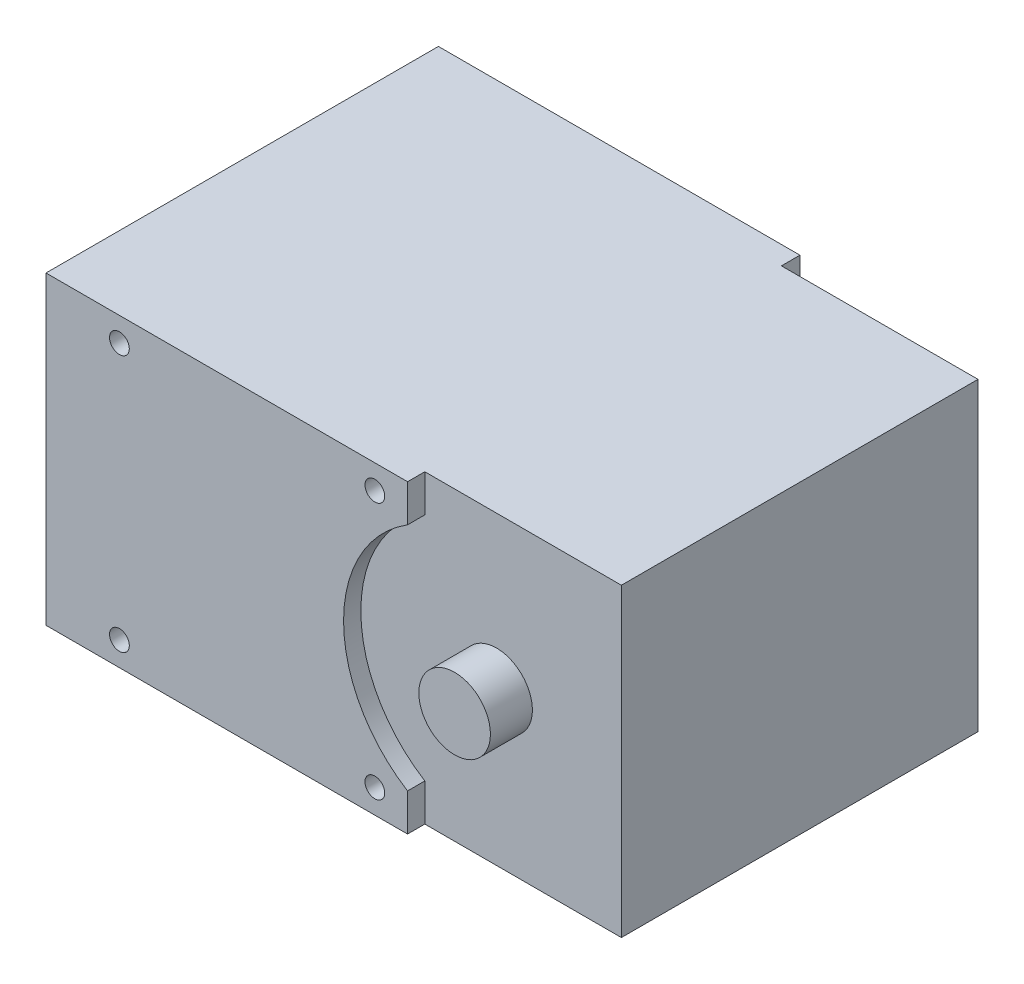
ISO-10303-21;
HEADER;
FILE_DESCRIPTION(('STEP AP214'),'2;1');
FILE_NAME('part.step','',(''),(''),'','','');
FILE_SCHEMA(('AUTOMOTIVE_DESIGN { 1 0 10303 214 1 1 1 1 }'));
ENDSEC;
DATA;
#1=APPLICATION_CONTEXT('core data for automotive mechanical design processes');
#2=APPLICATION_PROTOCOL_DEFINITION('international standard','automotive_design',2000,#1);
#3=PRODUCT_CONTEXT('',#1,'mechanical');
#4=PRODUCT('Part','Part','',(#3));
#5=PRODUCT_RELATED_PRODUCT_CATEGORY('part','',(#4));
#6=PRODUCT_DEFINITION_FORMATION('','',#4);
#7=PRODUCT_DEFINITION_CONTEXT('part definition',#1,'design');
#8=PRODUCT_DEFINITION('design','',#6,#7);
#9=PRODUCT_DEFINITION_SHAPE('','',#8);
#10=(LENGTH_UNIT() NAMED_UNIT(*) SI_UNIT(.MILLI.,.METRE.));
#11=(NAMED_UNIT(*) PLANE_ANGLE_UNIT() SI_UNIT($,.RADIAN.));
#12=(NAMED_UNIT(*) SI_UNIT($,.STERADIAN.) SOLID_ANGLE_UNIT());
#13=UNCERTAINTY_MEASURE_WITH_UNIT(LENGTH_MEASURE(1.E-05),#10,'distance_accuracy_value','');
#14=(GEOMETRIC_REPRESENTATION_CONTEXT(3) GLOBAL_UNCERTAINTY_ASSIGNED_CONTEXT((#13)) GLOBAL_UNIT_ASSIGNED_CONTEXT((#10,
#11,#12)) REPRESENTATION_CONTEXT('',''));
#15=CARTESIAN_POINT('',(0.,0.,0.));
#16=DIRECTION('',(0.,0.,1.));
#17=DIRECTION('',(1.,0.,0.));
#18=AXIS2_PLACEMENT_3D('',#15,#16,#17);
#19=CARTESIAN_POINT('',(0.,0.,28.9));
#20=DIRECTION('',(0.,1.,0.));
#21=DIRECTION('',(0.,0.,1.));
#22=AXIS2_PLACEMENT_3D('',#19,#20,#21);
#23=PLANE('',#22);
#24=DIRECTION('',(0.,0.,-1.));
#25=VECTOR('',#24,1.);
#26=CARTESIAN_POINT('',(0.,0.,28.9));
#27=LINE('',#26,#25);
#28=CARTESIAN_POINT('',(0.,0.,30.3));
#29=VERTEX_POINT('',#28);
#30=CARTESIAN_POINT('',(0.,0.,-1.5));
#31=VERTEX_POINT('',#30);
#32=EDGE_CURVE('E343',#29,#31,#27,.T.);
#33=ORIENTED_EDGE('',*,*,#32,.T.);
#34=DIRECTION('',(-1.,0.,0.));
#35=VECTOR('',#34,1.);
#36=CARTESIAN_POINT('',(0.,0.,-1.5));
#37=LINE('',#36,#35);
#38=CARTESIAN_POINT('',(29.3,0.,-1.5));
#39=VERTEX_POINT('',#38);
#40=EDGE_CURVE('E211',#39,#31,#37,.T.);
#41=ORIENTED_EDGE('',*,*,#40,.F.);
#42=DIRECTION('',(0.,0.,1.));
#43=VECTOR('',#42,1.);
#44=CARTESIAN_POINT('',(29.3,0.,-1.5));
#45=LINE('',#44,#43);
#46=CARTESIAN_POINT('',(29.3,0.,0.));
#47=VERTEX_POINT('',#46);
#48=EDGE_CURVE('E241',#39,#47,#45,.T.);
#49=ORIENTED_EDGE('',*,*,#48,.T.);
#50=DIRECTION('',(1.,0.,0.));
#51=VECTOR('',#50,1.);
#52=CARTESIAN_POINT('',(0.,0.,0.));
#53=LINE('',#52,#51);
#54=CARTESIAN_POINT('',(45.23,0.,0.));
#55=VERTEX_POINT('',#54);
#56=EDGE_CURVE('E320',#47,#55,#53,.T.);
#57=ORIENTED_EDGE('',*,*,#56,.T.);
#58=DIRECTION('',(0.,0.,-1.));
#59=VECTOR('',#58,1.);
#60=CARTESIAN_POINT('',(45.23,0.,28.9));
#61=LINE('',#60,#59);
#62=CARTESIAN_POINT('',(45.23,0.,28.9));
#63=VERTEX_POINT('',#62);
#64=EDGE_CURVE('E340',#63,#55,#61,.T.);
#65=ORIENTED_EDGE('',*,*,#64,.F.);
#66=DIRECTION('',(1.,0.,0.));
#67=VECTOR('',#66,1.);
#68=CARTESIAN_POINT('',(0.,0.,28.9));
#69=LINE('',#68,#67);
#70=CARTESIAN_POINT('',(29.3,0.,28.9));
#71=VERTEX_POINT('',#70);
#72=EDGE_CURVE('E321',#71,#63,#69,.T.);
#73=ORIENTED_EDGE('',*,*,#72,.F.);
#74=DIRECTION('',(0.,0.,-1.));
#75=VECTOR('',#74,1.);
#76=CARTESIAN_POINT('',(29.3,0.,30.3));
#77=LINE('',#76,#75);
#78=CARTESIAN_POINT('',(29.3,0.,30.3));
#79=VERTEX_POINT('',#78);
#80=EDGE_CURVE('E311',#79,#71,#77,.T.);
#81=ORIENTED_EDGE('',*,*,#80,.F.);
#82=DIRECTION('',(1.,0.,0.));
#83=VECTOR('',#82,1.);
#84=CARTESIAN_POINT('',(0.,0.,30.3));
#85=LINE('',#84,#83);
#86=EDGE_CURVE('E297',#29,#79,#85,.T.);
#87=ORIENTED_EDGE('',*,*,#86,.F.);
#88=EDGE_LOOP('',(#33,#41,#49,#57,#65,#73,#81,#87));
#89=FACE_BOUND('',#88,.T.);
#90=ADVANCED_FACE('F63',(#89),#23,.F.);
#91=CARTESIAN_POINT('',(0.,24.73,28.9));
#92=DIRECTION('',(0.,-1.,0.));
#93=DIRECTION('',(0.,0.,-1.));
#94=AXIS2_PLACEMENT_3D('',#91,#92,#93);
#95=PLANE('',#94);
#96=DIRECTION('',(0.,0.,1.));
#97=VECTOR('',#96,1.);
#98=CARTESIAN_POINT('',(29.3,24.73,-1.5));
#99=LINE('',#98,#97);
#100=CARTESIAN_POINT('',(29.3,24.73,-1.5));
#101=VERTEX_POINT('',#100);
#102=CARTESIAN_POINT('',(29.3,24.73,0.));
#103=VERTEX_POINT('',#102);
#104=EDGE_CURVE('E238',#101,#103,#99,.T.);
#105=ORIENTED_EDGE('',*,*,#104,.F.);
#106=DIRECTION('',(1.,0.,0.));
#107=VECTOR('',#106,1.);
#108=CARTESIAN_POINT('',(0.,24.73,-1.5));
#109=LINE('',#108,#107);
#110=CARTESIAN_POINT('',(0.,24.73,-1.5));
#111=VERTEX_POINT('',#110);
#112=EDGE_CURVE('E215',#111,#101,#109,.T.);
#113=ORIENTED_EDGE('',*,*,#112,.F.);
#114=DIRECTION('',(0.,0.,-1.));
#115=VECTOR('',#114,1.);
#116=CARTESIAN_POINT('',(0.,24.73,28.9));
#117=LINE('',#116,#115);
#118=CARTESIAN_POINT('',(0.,24.73,30.3));
#119=VERTEX_POINT('',#118);
#120=EDGE_CURVE('E329',#119,#111,#117,.T.);
#121=ORIENTED_EDGE('',*,*,#120,.F.);
#122=DIRECTION('',(-1.,0.,0.));
#123=VECTOR('',#122,1.);
#124=CARTESIAN_POINT('',(0.,24.73,30.3));
#125=LINE('',#124,#123);
#126=CARTESIAN_POINT('',(29.3,24.73,30.3));
#127=VERTEX_POINT('',#126);
#128=EDGE_CURVE('E291',#127,#119,#125,.T.);
#129=ORIENTED_EDGE('',*,*,#128,.F.);
#130=DIRECTION('',(0.,0.,-1.));
#131=VECTOR('',#130,1.);
#132=CARTESIAN_POINT('',(29.3,24.73,30.3));
#133=LINE('',#132,#131);
#134=CARTESIAN_POINT('',(29.3,24.73,28.9));
#135=VERTEX_POINT('',#134);
#136=EDGE_CURVE('E313',#127,#135,#133,.T.);
#137=ORIENTED_EDGE('',*,*,#136,.T.);
#138=DIRECTION('',(-1.,0.,0.));
#139=VECTOR('',#138,1.);
#140=CARTESIAN_POINT('',(0.,24.73,28.9));
#141=LINE('',#140,#139);
#142=CARTESIAN_POINT('',(45.23,24.73,28.9));
#143=VERTEX_POINT('',#142);
#144=EDGE_CURVE('E326',#143,#135,#141,.T.);
#145=ORIENTED_EDGE('',*,*,#144,.F.);
#146=DIRECTION('',(0.,0.,-1.));
#147=VECTOR('',#146,1.);
#148=CARTESIAN_POINT('',(45.23,24.73,28.9));
#149=LINE('',#148,#147);
#150=CARTESIAN_POINT('',(45.23,24.73,0.));
#151=VERTEX_POINT('',#150);
#152=EDGE_CURVE('E337',#143,#151,#149,.T.);
#153=ORIENTED_EDGE('',*,*,#152,.T.);
#154=DIRECTION('',(-1.,0.,0.));
#155=VECTOR('',#154,1.);
#156=CARTESIAN_POINT('',(0.,24.73,0.));
#157=LINE('',#156,#155);
#158=EDGE_CURVE('E324',#151,#103,#157,.T.);
#159=ORIENTED_EDGE('',*,*,#158,.T.);
#160=EDGE_LOOP('',(#105,#113,#121,#129,#137,#145,#153,#159));
#161=FACE_BOUND('',#160,.T.);
#162=ADVANCED_FACE('F382',(#161),#95,.F.);
#163=CARTESIAN_POINT('',(0.,0.,28.9));
#164=DIRECTION('',(1.,0.,0.));
#165=DIRECTION('',(0.,0.,-1.));
#166=AXIS2_PLACEMENT_3D('',#163,#164,#165);
#167=PLANE('',#166);
#168=ORIENTED_EDGE('',*,*,#120,.T.);
#169=DIRECTION('',(0.,1.,0.));
#170=VECTOR('',#169,1.);
#171=CARTESIAN_POINT('',(0.,0.,-1.5));
#172=LINE('',#171,#170);
#173=EDGE_CURVE('E213',#31,#111,#172,.T.);
#174=ORIENTED_EDGE('',*,*,#173,.F.);
#175=ORIENTED_EDGE('',*,*,#32,.F.);
#176=DIRECTION('',(0.,-1.,0.));
#177=VECTOR('',#176,1.);
#178=CARTESIAN_POINT('',(0.,0.,30.3));
#179=LINE('',#178,#177);
#180=EDGE_CURVE('E294',#119,#29,#179,.T.);
#181=ORIENTED_EDGE('',*,*,#180,.F.);
#182=EDGE_LOOP('',(#168,#174,#175,#181));
#183=FACE_BOUND('',#182,.T.);
#184=ADVANCED_FACE('F65',(#183),#167,.F.);
#185=CARTESIAN_POINT('',(45.23,0.,28.9));
#186=DIRECTION('',(-1.,0.,0.));
#187=DIRECTION('',(0.,0.,1.));
#188=AXIS2_PLACEMENT_3D('',#185,#186,#187);
#189=PLANE('',#188);
#190=DIRECTION('',(0.,1.,0.));
#191=VECTOR('',#190,1.);
#192=CARTESIAN_POINT('',(45.23,0.,0.));
#193=LINE('',#192,#191);
#194=EDGE_CURVE('E331',#55,#151,#193,.T.);
#195=ORIENTED_EDGE('',*,*,#194,.T.);
#196=ORIENTED_EDGE('',*,*,#152,.F.);
#197=DIRECTION('',(0.,1.,0.));
#198=VECTOR('',#197,1.);
#199=CARTESIAN_POINT('',(45.23,0.,28.9));
#200=LINE('',#199,#198);
#201=EDGE_CURVE('E323',#63,#143,#200,.T.);
#202=ORIENTED_EDGE('',*,*,#201,.F.);
#203=ORIENTED_EDGE('',*,*,#64,.T.);
#204=EDGE_LOOP('',(#195,#196,#202,#203));
#205=FACE_BOUND('',#204,.T.);
#206=ADVANCED_FACE('F390',(#205),#189,.F.);
#207=CARTESIAN_POINT('',(0.,0.,28.9));
#208=DIRECTION('',(0.,0.,-1.));
#209=DIRECTION('',(-1.,0.,0.));
#210=AXIS2_PLACEMENT_3D('',#207,#208,#209);
#211=PLANE('',#210);
#212=CARTESIAN_POINT('',(35.115,12.365,28.9));
#213=DIRECTION('',(0.,0.,-1.));
#214=DIRECTION('',(-1.,0.,0.));
#215=AXIS2_PLACEMENT_3D('',#212,#213,#214);
#216=CIRCLE('',#215,2.9);
#217=CARTESIAN_POINT('',(32.215,12.365,28.9));
#218=VERTEX_POINT('',#217);
#219=EDGE_CURVE('E346',#218,#218,#216,.F.);
#220=ORIENTED_EDGE('',*,*,#219,.F.);
#221=EDGE_LOOP('',(#220));
#222=FACE_BOUND('',#221,.T.);
#223=ORIENTED_EDGE('',*,*,#144,.T.);
#224=DIRECTION('',(0.,-1.,0.));
#225=VECTOR('',#224,1.);
#226=CARTESIAN_POINT('',(29.3,0.,28.9));
#227=LINE('',#226,#225);
#228=CARTESIAN_POINT('',(29.3,21.7023323278118,28.9));
#229=VERTEX_POINT('',#228);
#230=EDGE_CURVE('E305',#135,#229,#227,.T.);
#231=ORIENTED_EDGE('',*,*,#230,.T.);
#232=CARTESIAN_POINT('',(35.115,12.365,28.9));
#233=DIRECTION('',(0.,0.,1.));
#234=DIRECTION('',(1.,0.,0.));
#235=AXIS2_PLACEMENT_3D('',#232,#233,#234);
#236=CIRCLE('',#235,11.);
#237=CARTESIAN_POINT('',(29.3,3.02766767218816,28.9));
#238=VERTEX_POINT('',#237);
#239=EDGE_CURVE('E281',#229,#238,#236,.T.);
#240=ORIENTED_EDGE('',*,*,#239,.T.);
#241=DIRECTION('',(0.,-1.,0.));
#242=VECTOR('',#241,1.);
#243=CARTESIAN_POINT('',(29.3,0.,28.9));
#244=LINE('',#243,#242);
#245=EDGE_CURVE('E288',#238,#71,#244,.T.);
#246=ORIENTED_EDGE('',*,*,#245,.T.);
#247=ORIENTED_EDGE('',*,*,#72,.T.);
#248=ORIENTED_EDGE('',*,*,#201,.T.);
#249=EDGE_LOOP('',(#223,#231,#240,#246,#247,#248));
#250=FACE_BOUND('',#249,.T.);
#251=ADVANCED_FACE('F392',(#222,#250),#211,.F.);
#252=CARTESIAN_POINT('',(0.,0.,0.));
#253=DIRECTION('',(0.,0.,-1.));
#254=DIRECTION('',(-1.,0.,0.));
#255=AXIS2_PLACEMENT_3D('',#252,#253,#254);
#256=PLANE('',#255);
#257=CARTESIAN_POINT('',(35.115,12.365,0.));
#258=DIRECTION('',(0.,0.,-1.));
#259=DIRECTION('',(-1.,0.,0.));
#260=AXIS2_PLACEMENT_3D('',#257,#258,#259);
#261=CIRCLE('',#260,2.9);
#262=CARTESIAN_POINT('',(32.215,12.365,0.));
#263=VERTEX_POINT('',#262);
#264=EDGE_CURVE('E359',#263,#263,#261,.T.);
#265=ORIENTED_EDGE('',*,*,#264,.F.);
#266=EDGE_LOOP('',(#265));
#267=FACE_BOUND('',#266,.T.);
#268=DIRECTION('',(0.,-1.,0.));
#269=VECTOR('',#268,1.);
#270=CARTESIAN_POINT('',(29.3,0.,0.));
#271=LINE('',#270,#269);
#272=CARTESIAN_POINT('',(29.3,21.7023323278118,0.));
#273=VERTEX_POINT('',#272);
#274=EDGE_CURVE('E209',#103,#273,#271,.T.);
#275=ORIENTED_EDGE('',*,*,#274,.F.);
#276=ORIENTED_EDGE('',*,*,#158,.F.);
#277=ORIENTED_EDGE('',*,*,#194,.F.);
#278=ORIENTED_EDGE('',*,*,#56,.F.);
#279=DIRECTION('',(0.,-1.,0.));
#280=VECTOR('',#279,1.);
#281=CARTESIAN_POINT('',(29.3,0.,0.));
#282=LINE('',#281,#280);
#283=CARTESIAN_POINT('',(29.3,3.02766767218816,0.));
#284=VERTEX_POINT('',#283);
#285=EDGE_CURVE('E199',#284,#47,#282,.T.);
#286=ORIENTED_EDGE('',*,*,#285,.F.);
#287=CARTESIAN_POINT('',(35.115,12.365,0.));
#288=DIRECTION('',(0.,0.,-1.));
#289=DIRECTION('',(-1.,0.,0.));
#290=AXIS2_PLACEMENT_3D('',#287,#288,#289);
#291=CIRCLE('',#290,11.);
#292=EDGE_CURVE('E196',#284,#273,#291,.T.);
#293=ORIENTED_EDGE('',*,*,#292,.T.);
#294=EDGE_LOOP('',(#275,#276,#277,#278,#286,#293));
#295=FACE_BOUND('',#294,.T.);
#296=ADVANCED_FACE('F395',(#267,#295),#256,.T.);
#297=CARTESIAN_POINT('',(35.115,12.365,32.3));
#298=DIRECTION('',(0.,0.,-1.));
#299=DIRECTION('',(-1.,0.,0.));
#300=AXIS2_PLACEMENT_3D('',#297,#298,#299);
#301=CYLINDRICAL_SURFACE('',#300,2.9);
#302=CARTESIAN_POINT('',(35.115,12.365,32.3));
#303=DIRECTION('',(0.,0.,1.));
#304=DIRECTION('',(1.,0.,0.));
#305=AXIS2_PLACEMENT_3D('',#302,#303,#304);
#306=CIRCLE('',#305,2.9);
#307=CARTESIAN_POINT('',(38.015,12.365,32.3));
#308=VERTEX_POINT('',#307);
#309=EDGE_CURVE('E317',#308,#308,#306,.T.);
#310=ORIENTED_EDGE('',*,*,#309,.F.);
#311=EDGE_LOOP('',(#310));
#312=FACE_BOUND('',#311,.T.);
#313=ORIENTED_EDGE('',*,*,#219,.T.);
#314=EDGE_LOOP('',(#313));
#315=FACE_BOUND('',#314,.T.);
#316=ADVANCED_FACE('F398',(#312,#315),#301,.T.);
#317=CARTESIAN_POINT('',(35.115,12.365,32.3));
#318=DIRECTION('',(0.,0.,1.));
#319=DIRECTION('',(1.,0.,0.));
#320=AXIS2_PLACEMENT_3D('',#317,#318,#319);
#321=PLANE('',#320);
#322=ORIENTED_EDGE('',*,*,#309,.T.);
#323=EDGE_LOOP('',(#322));
#324=FACE_BOUND('',#323,.T.);
#325=ADVANCED_FACE('F405',(#324),#321,.T.);
#326=CARTESIAN_POINT('',(35.115,12.365,30.3));
#327=DIRECTION('',(0.,0.,-1.));
#328=DIRECTION('',(-1.,0.,0.));
#329=AXIS2_PLACEMENT_3D('',#326,#327,#328);
#330=CYLINDRICAL_SURFACE('',#329,11.);
#331=ORIENTED_EDGE('',*,*,#239,.F.);
#332=DIRECTION('',(0.,0.,-1.));
#333=VECTOR('',#332,1.);
#334=CARTESIAN_POINT('',(29.3,21.7023323278118,30.3));
#335=LINE('',#334,#333);
#336=CARTESIAN_POINT('',(29.3,21.7023323278118,30.3));
#337=VERTEX_POINT('',#336);
#338=EDGE_CURVE('E315',#337,#229,#335,.T.);
#339=ORIENTED_EDGE('',*,*,#338,.F.);
#340=CARTESIAN_POINT('',(35.115,12.365,30.3));
#341=DIRECTION('',(0.,0.,1.));
#342=DIRECTION('',(1.,0.,0.));
#343=AXIS2_PLACEMENT_3D('',#340,#341,#342);
#344=CIRCLE('',#343,11.);
#345=CARTESIAN_POINT('',(29.3,3.02766767218816,30.3));
#346=VERTEX_POINT('',#345);
#347=EDGE_CURVE('E284',#337,#346,#344,.T.);
#348=ORIENTED_EDGE('',*,*,#347,.T.);
#349=DIRECTION('',(0.,0.,-1.));
#350=VECTOR('',#349,1.);
#351=CARTESIAN_POINT('',(29.3,3.02766767218816,30.3));
#352=LINE('',#351,#350);
#353=EDGE_CURVE('E302',#346,#238,#352,.T.);
#354=ORIENTED_EDGE('',*,*,#353,.T.);
#355=EDGE_LOOP('',(#331,#339,#348,#354));
#356=FACE_BOUND('',#355,.T.);
#357=ADVANCED_FACE('F409',(#356),#330,.F.);
#358=CARTESIAN_POINT('',(29.3,0.,30.3));
#359=DIRECTION('',(1.,0.,0.));
#360=DIRECTION('',(0.,0.,-1.));
#361=AXIS2_PLACEMENT_3D('',#358,#359,#360);
#362=PLANE('',#361);
#363=ORIENTED_EDGE('',*,*,#230,.F.);
#364=ORIENTED_EDGE('',*,*,#136,.F.);
#365=DIRECTION('',(0.,-1.,0.));
#366=VECTOR('',#365,1.);
#367=CARTESIAN_POINT('',(29.3,0.,30.3));
#368=LINE('',#367,#366);
#369=EDGE_CURVE('E287',#127,#337,#368,.T.);
#370=ORIENTED_EDGE('',*,*,#369,.T.);
#371=ORIENTED_EDGE('',*,*,#338,.T.);
#372=EDGE_LOOP('',(#363,#364,#370,#371));
#373=FACE_BOUND('',#372,.T.);
#374=ADVANCED_FACE('F413',(#373),#362,.T.);
#375=CARTESIAN_POINT('',(29.3,0.,30.3));
#376=DIRECTION('',(1.,0.,0.));
#377=DIRECTION('',(0.,1.,0.));
#378=AXIS2_PLACEMENT_3D('',#375,#376,#377);
#379=PLANE('',#378);
#380=ORIENTED_EDGE('',*,*,#245,.F.);
#381=ORIENTED_EDGE('',*,*,#353,.F.);
#382=DIRECTION('',(0.,-1.,0.));
#383=VECTOR('',#382,1.);
#384=CARTESIAN_POINT('',(29.3,0.,30.3));
#385=LINE('',#384,#383);
#386=EDGE_CURVE('E299',#346,#79,#385,.T.);
#387=ORIENTED_EDGE('',*,*,#386,.T.);
#388=ORIENTED_EDGE('',*,*,#80,.T.);
#389=EDGE_LOOP('',(#380,#381,#387,#388));
#390=FACE_BOUND('',#389,.T.);
#391=ADVANCED_FACE('F417',(#390),#379,.T.);
#392=CARTESIAN_POINT('',(0.,0.,30.3));
#393=DIRECTION('',(0.,0.,1.));
#394=DIRECTION('',(1.,0.,0.));
#395=AXIS2_PLACEMENT_3D('',#392,#393,#394);
#396=PLANE('',#395);
#397=CARTESIAN_POINT('',(5.95,1.95,30.3));
#398=DIRECTION('',(0.,0.,1.));
#399=DIRECTION('',(-1.,0.,0.));
#400=AXIS2_PLACEMENT_3D('',#397,#398,#399);
#401=CIRCLE('',#400,0.800000000000001);
#402=CARTESIAN_POINT('',(5.15,1.95,30.3));
#403=VERTEX_POINT('',#402);
#404=EDGE_CURVE('E259',#403,#403,#401,.T.);
#405=ORIENTED_EDGE('',*,*,#404,.F.);
#406=EDGE_LOOP('',(#405));
#407=FACE_BOUND('',#406,.T.);
#408=CARTESIAN_POINT('',(26.65,1.95,30.3));
#409=DIRECTION('',(0.,0.,1.));
#410=DIRECTION('',(-1.,0.,0.));
#411=AXIS2_PLACEMENT_3D('',#408,#409,#410);
#412=CIRCLE('',#411,0.799999999999999);
#413=CARTESIAN_POINT('',(25.85,1.95,30.3));
#414=VERTEX_POINT('',#413);
#415=EDGE_CURVE('E270',#414,#414,#412,.T.);
#416=ORIENTED_EDGE('',*,*,#415,.F.);
#417=EDGE_LOOP('',(#416));
#418=FACE_BOUND('',#417,.T.);
#419=CARTESIAN_POINT('',(26.65,22.78,30.3));
#420=DIRECTION('',(0.,0.,1.));
#421=DIRECTION('',(1.,0.,0.));
#422=AXIS2_PLACEMENT_3D('',#419,#420,#421);
#423=CIRCLE('',#422,0.799999999999999);
#424=CARTESIAN_POINT('',(27.45,22.78,30.3));
#425=VERTEX_POINT('',#424);
#426=EDGE_CURVE('E264',#425,#425,#423,.T.);
#427=ORIENTED_EDGE('',*,*,#426,.F.);
#428=EDGE_LOOP('',(#427));
#429=FACE_BOUND('',#428,.T.);
#430=CARTESIAN_POINT('',(5.95,22.78,30.3));
#431=DIRECTION('',(0.,0.,1.));
#432=DIRECTION('',(1.,0.,0.));
#433=AXIS2_PLACEMENT_3D('',#430,#431,#432);
#434=CIRCLE('',#433,0.8);
#435=CARTESIAN_POINT('',(6.75,22.78,30.3));
#436=VERTEX_POINT('',#435);
#437=EDGE_CURVE('E263',#436,#436,#434,.T.);
#438=ORIENTED_EDGE('',*,*,#437,.F.);
#439=EDGE_LOOP('',(#438));
#440=FACE_BOUND('',#439,.T.);
#441=ORIENTED_EDGE('',*,*,#347,.F.);
#442=ORIENTED_EDGE('',*,*,#369,.F.);
#443=ORIENTED_EDGE('',*,*,#128,.T.);
#444=ORIENTED_EDGE('',*,*,#180,.T.);
#445=ORIENTED_EDGE('',*,*,#86,.T.);
#446=ORIENTED_EDGE('',*,*,#386,.F.);
#447=EDGE_LOOP('',(#441,#442,#443,#444,#445,#446));
#448=FACE_BOUND('',#447,.T.);
#449=ADVANCED_FACE('F421',(#407,#418,#429,#440,#448),#396,.T.);
#450=CARTESIAN_POINT('',(5.95,22.78,25.3));
#451=DIRECTION('',(0.,0.,1.));
#452=DIRECTION('',(1.,0.,0.));
#453=AXIS2_PLACEMENT_3D('',#450,#451,#452);
#454=CYLINDRICAL_SURFACE('',#453,0.8);
#455=CARTESIAN_POINT('',(5.95,22.78,25.3));
#456=DIRECTION('',(0.,0.,1.));
#457=DIRECTION('',(1.,0.,0.));
#458=AXIS2_PLACEMENT_3D('',#455,#456,#457);
#459=CIRCLE('',#458,0.8);
#460=CARTESIAN_POINT('',(6.75,22.78,25.3));
#461=VERTEX_POINT('',#460);
#462=EDGE_CURVE('E278',#461,#461,#459,.T.);
#463=ORIENTED_EDGE('',*,*,#462,.F.);
#464=EDGE_LOOP('',(#463));
#465=FACE_BOUND('',#464,.T.);
#466=ORIENTED_EDGE('',*,*,#437,.T.);
#467=EDGE_LOOP('',(#466));
#468=FACE_BOUND('',#467,.T.);
#469=ADVANCED_FACE('F425',(#465,#468),#454,.F.);
#470=CARTESIAN_POINT('',(5.95,22.78,25.3));
#471=DIRECTION('',(0.,0.,1.));
#472=DIRECTION('',(1.,0.,0.));
#473=AXIS2_PLACEMENT_3D('',#470,#471,#472);
#474=PLANE('',#473);
#475=ORIENTED_EDGE('',*,*,#462,.T.);
#476=EDGE_LOOP('',(#475));
#477=FACE_BOUND('',#476,.T.);
#478=ADVANCED_FACE('F429',(#477),#474,.T.);
#479=CARTESIAN_POINT('',(26.65,22.78,25.3));
#480=DIRECTION('',(0.,0.,1.));
#481=DIRECTION('',(1.,0.,0.));
#482=AXIS2_PLACEMENT_3D('',#479,#480,#481);
#483=CYLINDRICAL_SURFACE('',#482,0.799999999999999);
#484=CARTESIAN_POINT('',(26.65,22.78,25.3));
#485=DIRECTION('',(0.,0.,1.));
#486=DIRECTION('',(1.,0.,0.));
#487=AXIS2_PLACEMENT_3D('',#484,#485,#486);
#488=CIRCLE('',#487,0.799999999999999);
#489=CARTESIAN_POINT('',(27.45,22.78,25.3));
#490=VERTEX_POINT('',#489);
#491=EDGE_CURVE('E260',#490,#490,#488,.T.);
#492=ORIENTED_EDGE('',*,*,#491,.F.);
#493=EDGE_LOOP('',(#492));
#494=FACE_BOUND('',#493,.T.);
#495=ORIENTED_EDGE('',*,*,#426,.T.);
#496=EDGE_LOOP('',(#495));
#497=FACE_BOUND('',#496,.T.);
#498=ADVANCED_FACE('F433',(#494,#497),#483,.F.);
#499=CARTESIAN_POINT('',(26.65,22.78,25.3));
#500=DIRECTION('',(0.,0.,1.));
#501=DIRECTION('',(1.,0.,0.));
#502=AXIS2_PLACEMENT_3D('',#499,#500,#501);
#503=PLANE('',#502);
#504=ORIENTED_EDGE('',*,*,#491,.T.);
#505=EDGE_LOOP('',(#504));
#506=FACE_BOUND('',#505,.T.);
#507=ADVANCED_FACE('F448',(#506),#503,.T.);
#508=CARTESIAN_POINT('',(26.65,1.95,25.3));
#509=DIRECTION('',(0.,0.,1.));
#510=DIRECTION('',(1.,0.,0.));
#511=AXIS2_PLACEMENT_3D('',#508,#509,#510);
#512=CYLINDRICAL_SURFACE('',#511,0.799999999999999);
#513=CARTESIAN_POINT('',(26.65,1.95,25.3));
#514=DIRECTION('',(0.,0.,1.));
#515=DIRECTION('',(-1.,0.,0.));
#516=AXIS2_PLACEMENT_3D('',#513,#514,#515);
#517=CIRCLE('',#516,0.799999999999999);
#518=CARTESIAN_POINT('',(25.85,1.95,25.3));
#519=VERTEX_POINT('',#518);
#520=EDGE_CURVE('E267',#519,#519,#517,.T.);
#521=ORIENTED_EDGE('',*,*,#520,.F.);
#522=EDGE_LOOP('',(#521));
#523=FACE_BOUND('',#522,.T.);
#524=ORIENTED_EDGE('',*,*,#415,.T.);
#525=EDGE_LOOP('',(#524));
#526=FACE_BOUND('',#525,.T.);
#527=ADVANCED_FACE('F445',(#523,#526),#512,.F.);
#528=CARTESIAN_POINT('',(26.65,1.95,25.3));
#529=DIRECTION('',(0.,0.,-1.));
#530=DIRECTION('',(-1.,0.,0.));
#531=AXIS2_PLACEMENT_3D('',#528,#529,#530);
#532=PLANE('',#531);
#533=ORIENTED_EDGE('',*,*,#520,.T.);
#534=EDGE_LOOP('',(#533));
#535=FACE_BOUND('',#534,.T.);
#536=ADVANCED_FACE('F439',(#535),#532,.F.);
#537=CARTESIAN_POINT('',(5.95,1.95,25.3));
#538=DIRECTION('',(0.,0.,1.));
#539=DIRECTION('',(1.,0.,0.));
#540=AXIS2_PLACEMENT_3D('',#537,#538,#539);
#541=CYLINDRICAL_SURFACE('',#540,0.800000000000001);
#542=CARTESIAN_POINT('',(5.95,1.95,25.3));
#543=DIRECTION('',(0.,0.,1.));
#544=DIRECTION('',(-1.,0.,0.));
#545=AXIS2_PLACEMENT_3D('',#542,#543,#544);
#546=CIRCLE('',#545,0.800000000000001);
#547=CARTESIAN_POINT('',(5.15,1.95,25.3));
#548=VERTEX_POINT('',#547);
#549=EDGE_CURVE('E273',#548,#548,#546,.T.);
#550=ORIENTED_EDGE('',*,*,#549,.F.);
#551=EDGE_LOOP('',(#550));
#552=FACE_BOUND('',#551,.T.);
#553=ORIENTED_EDGE('',*,*,#404,.T.);
#554=EDGE_LOOP('',(#553));
#555=FACE_BOUND('',#554,.T.);
#556=ADVANCED_FACE('F435',(#552,#555),#541,.F.);
#557=CARTESIAN_POINT('',(5.95,1.95,25.3));
#558=DIRECTION('',(0.,0.,-1.));
#559=DIRECTION('',(-1.,0.,0.));
#560=AXIS2_PLACEMENT_3D('',#557,#558,#559);
#561=PLANE('',#560);
#562=ORIENTED_EDGE('',*,*,#549,.T.);
#563=EDGE_LOOP('',(#562));
#564=FACE_BOUND('',#563,.T.);
#565=ADVANCED_FACE('F438',(#564),#561,.F.);
#566=CARTESIAN_POINT('',(35.115,12.365,-1.5));
#567=DIRECTION('',(0.,0.,1.));
#568=DIRECTION('',(1.,0.,0.));
#569=AXIS2_PLACEMENT_3D('',#566,#567,#568);
#570=CYLINDRICAL_SURFACE('',#569,11.);
#571=ORIENTED_EDGE('',*,*,#292,.F.);
#572=DIRECTION('',(0.,0.,1.));
#573=VECTOR('',#572,1.);
#574=CARTESIAN_POINT('',(29.3,3.02766767218816,-1.5));
#575=LINE('',#574,#573);
#576=CARTESIAN_POINT('',(29.3,3.02766767218816,-1.5));
#577=VERTEX_POINT('',#576);
#578=EDGE_CURVE('E244',#577,#284,#575,.T.);
#579=ORIENTED_EDGE('',*,*,#578,.F.);
#580=CARTESIAN_POINT('',(35.115,12.365,-1.5));
#581=DIRECTION('',(0.,0.,-1.));
#582=DIRECTION('',(-1.,0.,0.));
#583=AXIS2_PLACEMENT_3D('',#580,#581,#582);
#584=CIRCLE('',#583,11.);
#585=CARTESIAN_POINT('',(29.3,21.7023323278118,-1.5));
#586=VERTEX_POINT('',#585);
#587=EDGE_CURVE('E205',#577,#586,#584,.T.);
#588=ORIENTED_EDGE('',*,*,#587,.T.);
#589=DIRECTION('',(0.,0.,1.));
#590=VECTOR('',#589,1.);
#591=CARTESIAN_POINT('',(29.3,21.7023323278118,-1.5));
#592=LINE('',#591,#590);
#593=EDGE_CURVE('E230',#586,#273,#592,.T.);
#594=ORIENTED_EDGE('',*,*,#593,.T.);
#595=EDGE_LOOP('',(#571,#579,#588,#594));
#596=FACE_BOUND('',#595,.T.);
#597=ADVANCED_FACE('F443',(#596),#570,.F.);
#598=CARTESIAN_POINT('',(29.3,0.,-1.5));
#599=DIRECTION('',(-1.,0.,0.));
#600=DIRECTION('',(0.,-1.,0.));
#601=AXIS2_PLACEMENT_3D('',#598,#599,#600);
#602=PLANE('',#601);
#603=ORIENTED_EDGE('',*,*,#285,.T.);
#604=ORIENTED_EDGE('',*,*,#48,.F.);
#605=DIRECTION('',(0.,-1.,0.));
#606=VECTOR('',#605,1.);
#607=CARTESIAN_POINT('',(29.3,0.,-1.5));
#608=LINE('',#607,#606);
#609=EDGE_CURVE('E208',#577,#39,#608,.T.);
#610=ORIENTED_EDGE('',*,*,#609,.F.);
#611=ORIENTED_EDGE('',*,*,#578,.T.);
#612=EDGE_LOOP('',(#603,#604,#610,#611));
#613=FACE_BOUND('',#612,.T.);
#614=ADVANCED_FACE('F493',(#613),#602,.F.);
#615=CARTESIAN_POINT('',(29.3,0.,-1.5));
#616=DIRECTION('',(-1.,0.,0.));
#617=DIRECTION('',(0.,0.,1.));
#618=AXIS2_PLACEMENT_3D('',#615,#616,#617);
#619=PLANE('',#618);
#620=ORIENTED_EDGE('',*,*,#274,.T.);
#621=ORIENTED_EDGE('',*,*,#593,.F.);
#622=DIRECTION('',(0.,-1.,0.));
#623=VECTOR('',#622,1.);
#624=CARTESIAN_POINT('',(29.3,0.,-1.5));
#625=LINE('',#624,#623);
#626=EDGE_CURVE('E217',#101,#586,#625,.T.);
#627=ORIENTED_EDGE('',*,*,#626,.F.);
#628=ORIENTED_EDGE('',*,*,#104,.T.);
#629=EDGE_LOOP('',(#620,#621,#627,#628));
#630=FACE_BOUND('',#629,.T.);
#631=ADVANCED_FACE('F497',(#630),#619,.F.);
#632=CARTESIAN_POINT('',(0.,0.,-1.5));
#633=DIRECTION('',(0.,0.,-1.));
#634=DIRECTION('',(-1.,0.,0.));
#635=AXIS2_PLACEMENT_3D('',#632,#633,#634);
#636=PLANE('',#635);
#637=ORIENTED_EDGE('',*,*,#173,.T.);
#638=ORIENTED_EDGE('',*,*,#112,.T.);
#639=ORIENTED_EDGE('',*,*,#626,.T.);
#640=ORIENTED_EDGE('',*,*,#587,.F.);
#641=ORIENTED_EDGE('',*,*,#609,.T.);
#642=ORIENTED_EDGE('',*,*,#40,.T.);
#643=EDGE_LOOP('',(#637,#638,#639,#640,#641,#642));
#644=FACE_BOUND('',#643,.T.);
#645=DIRECTION('',(0.,-1.,0.));
#646=VECTOR('',#645,1.);
#647=CARTESIAN_POINT('',(18.6,24.73,-1.5));
#648=LINE('',#647,#646);
#649=CARTESIAN_POINT('',(18.6,21.615,-1.5));
#650=VERTEX_POINT('',#649);
#651=CARTESIAN_POINT('',(18.6,3.115,-1.5));
#652=VERTEX_POINT('',#651);
#653=EDGE_CURVE('E189',#650,#652,#648,.T.);
#654=ORIENTED_EDGE('',*,*,#653,.F.);
#655=DIRECTION('',(1.,0.,0.));
#656=VECTOR('',#655,1.);
#657=CARTESIAN_POINT('',(19.736399629453,21.615,-1.5));
#658=LINE('',#657,#656);
#659=CARTESIAN_POINT('',(5.2,21.615,-1.5));
#660=VERTEX_POINT('',#659);
#661=EDGE_CURVE('E192',#660,#650,#658,.T.);
#662=ORIENTED_EDGE('',*,*,#661,.F.);
#663=DIRECTION('',(0.,-1.,0.));
#664=VECTOR('',#663,1.);
#665=CARTESIAN_POINT('',(5.2,24.73,-1.5));
#666=LINE('',#665,#664);
#667=CARTESIAN_POINT('',(5.2,3.115,-1.5));
#668=VERTEX_POINT('',#667);
#669=EDGE_CURVE('E191',#660,#668,#666,.T.);
#670=ORIENTED_EDGE('',*,*,#669,.T.);
#671=DIRECTION('',(-1.,0.,0.));
#672=VECTOR('',#671,1.);
#673=CARTESIAN_POINT('',(19.736399629453,3.115,-1.5));
#674=LINE('',#673,#672);
#675=EDGE_CURVE('E85',#652,#668,#674,.T.);
#676=ORIENTED_EDGE('',*,*,#675,.F.);
#677=EDGE_LOOP('',(#654,#662,#670,#676));
#678=FACE_BOUND('',#677,.T.);
#679=CARTESIAN_POINT('',(26.71,22.615,-1.5));
#680=DIRECTION('',(0.,0.,-1.));
#681=DIRECTION('',(-1.,0.,0.));
#682=AXIS2_PLACEMENT_3D('',#679,#680,#681);
#683=CIRCLE('',#682,0.799999999999999);
#684=CARTESIAN_POINT('',(25.91,22.615,-1.5));
#685=VERTEX_POINT('',#684);
#686=EDGE_CURVE('E222',#685,#685,#683,.F.);
#687=ORIENTED_EDGE('',*,*,#686,.T.);
#688=EDGE_LOOP('',(#687));
#689=FACE_BOUND('',#688,.T.);
#690=CARTESIAN_POINT('',(26.71,2.115,-1.5));
#691=DIRECTION('',(0.,0.,-1.));
#692=DIRECTION('',(-1.,0.,0.));
#693=AXIS2_PLACEMENT_3D('',#690,#691,#692);
#694=CIRCLE('',#693,0.799999999999999);
#695=CARTESIAN_POINT('',(25.91,2.115,-1.5));
#696=VERTEX_POINT('',#695);
#697=EDGE_CURVE('E228',#696,#696,#694,.F.);
#698=ORIENTED_EDGE('',*,*,#697,.T.);
#699=EDGE_LOOP('',(#698));
#700=FACE_BOUND('',#699,.T.);
#701=CARTESIAN_POINT('',(2.27,2.115,-1.5));
#702=DIRECTION('',(0.,0.,-1.));
#703=DIRECTION('',(-1.,0.,0.));
#704=AXIS2_PLACEMENT_3D('',#701,#702,#703);
#705=CIRCLE('',#704,0.8);
#706=CARTESIAN_POINT('',(1.47,2.115,-1.5));
#707=VERTEX_POINT('',#706);
#708=EDGE_CURVE('E219',#707,#707,#705,.F.);
#709=ORIENTED_EDGE('',*,*,#708,.T.);
#710=EDGE_LOOP('',(#709));
#711=FACE_BOUND('',#710,.T.);
#712=CARTESIAN_POINT('',(2.27,22.615,-1.5));
#713=DIRECTION('',(0.,0.,-1.));
#714=DIRECTION('',(-1.,0.,0.));
#715=AXIS2_PLACEMENT_3D('',#712,#713,#714);
#716=CIRCLE('',#715,0.799999999999999);
#717=CARTESIAN_POINT('',(1.47,22.615,-1.5));
#718=VERTEX_POINT('',#717);
#719=EDGE_CURVE('E225',#718,#718,#716,.F.);
#720=ORIENTED_EDGE('',*,*,#719,.T.);
#721=EDGE_LOOP('',(#720));
#722=FACE_BOUND('',#721,.T.);
#723=ADVANCED_FACE('F186',(#644,#678,#689,#700,#711,#722),#636,.T.);
#724=CARTESIAN_POINT('',(0.,0.,4.1));
#725=DIRECTION('',(0.,0.,-1.));
#726=DIRECTION('',(-1.,0.,0.));
#727=AXIS2_PLACEMENT_3D('',#724,#725,#726);
#728=PLANE('',#727);
#729=CARTESIAN_POINT('',(26.71,22.615,4.1));
#730=DIRECTION('',(0.,0.,-1.));
#731=DIRECTION('',(-1.,0.,0.));
#732=AXIS2_PLACEMENT_3D('',#729,#730,#731);
#733=CIRCLE('',#732,0.799999999999999);
#734=CARTESIAN_POINT('',(25.91,22.615,4.1));
#735=VERTEX_POINT('',#734);
#736=EDGE_CURVE('E251',#735,#735,#733,.T.);
#737=ORIENTED_EDGE('',*,*,#736,.T.);
#738=EDGE_LOOP('',(#737));
#739=FACE_BOUND('',#738,.T.);
#740=ADVANCED_FACE('F463',(#739),#728,.T.);
#741=CARTESIAN_POINT('',(26.71,22.615,4.1));
#742=DIRECTION('',(0.,0.,-1.));
#743=DIRECTION('',(-1.,0.,0.));
#744=AXIS2_PLACEMENT_3D('',#741,#742,#743);
#745=CYLINDRICAL_SURFACE('',#744,0.799999999999999);
#746=ORIENTED_EDGE('',*,*,#736,.F.);
#747=EDGE_LOOP('',(#746));
#748=FACE_BOUND('',#747,.T.);
#749=ORIENTED_EDGE('',*,*,#686,.F.);
#750=EDGE_LOOP('',(#749));
#751=FACE_BOUND('',#750,.T.);
#752=ADVANCED_FACE('F459',(#748,#751),#745,.F.);
#753=CARTESIAN_POINT('',(0.,0.,4.1));
#754=DIRECTION('',(0.,0.,-1.));
#755=DIRECTION('',(-1.,0.,0.));
#756=AXIS2_PLACEMENT_3D('',#753,#754,#755);
#757=PLANE('',#756);
#758=CARTESIAN_POINT('',(2.27,22.615,4.1));
#759=DIRECTION('',(0.,0.,-1.));
#760=DIRECTION('',(-1.,0.,0.));
#761=AXIS2_PLACEMENT_3D('',#758,#759,#760);
#762=CIRCLE('',#761,0.799999999999999);
#763=CARTESIAN_POINT('',(1.47,22.615,4.1));
#764=VERTEX_POINT('',#763);
#765=EDGE_CURVE('E248',#764,#764,#762,.T.);
#766=ORIENTED_EDGE('',*,*,#765,.T.);
#767=EDGE_LOOP('',(#766));
#768=FACE_BOUND('',#767,.T.);
#769=ADVANCED_FACE('F462',(#768),#757,.T.);
#770=CARTESIAN_POINT('',(2.27,22.615,4.1));
#771=DIRECTION('',(0.,0.,-1.));
#772=DIRECTION('',(-1.,0.,0.));
#773=AXIS2_PLACEMENT_3D('',#770,#771,#772);
#774=CYLINDRICAL_SURFACE('',#773,0.799999999999999);
#775=ORIENTED_EDGE('',*,*,#765,.F.);
#776=EDGE_LOOP('',(#775));
#777=FACE_BOUND('',#776,.T.);
#778=ORIENTED_EDGE('',*,*,#719,.F.);
#779=EDGE_LOOP('',(#778));
#780=FACE_BOUND('',#779,.T.);
#781=ADVANCED_FACE('F480',(#777,#780),#774,.F.);
#782=CARTESIAN_POINT('',(0.,0.,4.1));
#783=DIRECTION('',(0.,0.,-1.));
#784=DIRECTION('',(-1.,0.,0.));
#785=AXIS2_PLACEMENT_3D('',#782,#783,#784);
#786=PLANE('',#785);
#787=CARTESIAN_POINT('',(2.27,2.115,4.1));
#788=DIRECTION('',(0.,0.,-1.));
#789=DIRECTION('',(-1.,0.,0.));
#790=AXIS2_PLACEMENT_3D('',#787,#788,#789);
#791=CIRCLE('',#790,0.8);
#792=CARTESIAN_POINT('',(1.47,2.115,4.1));
#793=VERTEX_POINT('',#792);
#794=EDGE_CURVE('E252',#793,#793,#791,.T.);
#795=ORIENTED_EDGE('',*,*,#794,.T.);
#796=EDGE_LOOP('',(#795));
#797=FACE_BOUND('',#796,.T.);
#798=ADVANCED_FACE('F477',(#797),#786,.T.);
#799=CARTESIAN_POINT('',(2.27,2.115,4.1));
#800=DIRECTION('',(0.,0.,-1.));
#801=DIRECTION('',(-1.,0.,0.));
#802=AXIS2_PLACEMENT_3D('',#799,#800,#801);
#803=CYLINDRICAL_SURFACE('',#802,0.8);
#804=ORIENTED_EDGE('',*,*,#794,.F.);
#805=EDGE_LOOP('',(#804));
#806=FACE_BOUND('',#805,.T.);
#807=ORIENTED_EDGE('',*,*,#708,.F.);
#808=EDGE_LOOP('',(#807));
#809=FACE_BOUND('',#808,.T.);
#810=ADVANCED_FACE('F472',(#806,#809),#803,.F.);
#811=CARTESIAN_POINT('',(26.71,2.115,4.1));
#812=DIRECTION('',(0.,0.,-1.));
#813=DIRECTION('',(-1.,0.,0.));
#814=AXIS2_PLACEMENT_3D('',#811,#812,#813);
#815=PLANE('',#814);
#816=CARTESIAN_POINT('',(26.71,2.115,4.1));
#817=DIRECTION('',(0.,0.,-1.));
#818=DIRECTION('',(-1.,0.,0.));
#819=AXIS2_PLACEMENT_3D('',#816,#817,#818);
#820=CIRCLE('',#819,0.799999999999999);
#821=CARTESIAN_POINT('',(25.91,2.115,4.1));
#822=VERTEX_POINT('',#821);
#823=EDGE_CURVE('E247',#822,#822,#820,.T.);
#824=ORIENTED_EDGE('',*,*,#823,.T.);
#825=EDGE_LOOP('',(#824));
#826=FACE_BOUND('',#825,.T.);
#827=ADVANCED_FACE('F468',(#826),#815,.T.);
#828=CARTESIAN_POINT('',(26.71,2.115,4.1));
#829=DIRECTION('',(0.,0.,-1.));
#830=DIRECTION('',(-1.,0.,0.));
#831=AXIS2_PLACEMENT_3D('',#828,#829,#830);
#832=CYLINDRICAL_SURFACE('',#831,0.799999999999999);
#833=ORIENTED_EDGE('',*,*,#823,.F.);
#834=EDGE_LOOP('',(#833));
#835=FACE_BOUND('',#834,.T.);
#836=ORIENTED_EDGE('',*,*,#697,.F.);
#837=EDGE_LOOP('',(#836));
#838=FACE_BOUND('',#837,.T.);
#839=ADVANCED_FACE('F471',(#835,#838),#832,.F.);
#840=CARTESIAN_POINT('',(16.6,24.73,-3.5));
#841=DIRECTION('',(-0.70710678118655,0.,0.707106781186546));
#842=DIRECTION('',(0.707106781186546,0.,0.707106781186549));
#843=AXIS2_PLACEMENT_3D('',#840,#841,#842);
#844=PLANE('',#843);
#845=DIRECTION('',(0.,-1.,0.));
#846=VECTOR('',#845,1.);
#847=CARTESIAN_POINT('',(16.6,24.73,-3.5));
#848=LINE('',#847,#846);
#849=CARTESIAN_POINT('',(16.6,21.615,-3.5));
#850=VERTEX_POINT('',#849);
#851=CARTESIAN_POINT('',(16.6,3.115,-3.5));
#852=VERTEX_POINT('',#851);
#853=EDGE_CURVE('E197',#850,#852,#848,.T.);
#854=ORIENTED_EDGE('',*,*,#853,.F.);
#855=DIRECTION('',(0.707106781186546,0.,0.707106781186549));
#856=VECTOR('',#855,1.);
#857=CARTESIAN_POINT('',(16.6,21.615,-3.5));
#858=LINE('',#857,#856);
#859=EDGE_CURVE('E181',#850,#650,#858,.T.);
#860=ORIENTED_EDGE('',*,*,#859,.T.);
#861=ORIENTED_EDGE('',*,*,#653,.T.);
#862=DIRECTION('',(-0.707106781186546,0.,-0.707106781186549));
#863=VECTOR('',#862,1.);
#864=CARTESIAN_POINT('',(16.6,3.115,-3.5));
#865=LINE('',#864,#863);
#866=EDGE_CURVE('E173',#652,#852,#865,.T.);
#867=ORIENTED_EDGE('',*,*,#866,.T.);
#868=EDGE_LOOP('',(#854,#860,#861,#867));
#869=FACE_BOUND('',#868,.T.);
#870=ADVANCED_FACE('F195',(#869),#844,.F.);
#871=CARTESIAN_POINT('',(5.2,24.73,-3.5));
#872=DIRECTION('',(0.,0.,1.));
#873=DIRECTION('',(1.,0.,0.));
#874=AXIS2_PLACEMENT_3D('',#871,#872,#873);
#875=PLANE('',#874);
#876=DIRECTION('',(0.,-1.,0.));
#877=VECTOR('',#876,1.);
#878=CARTESIAN_POINT('',(5.2,24.73,-3.5));
#879=LINE('',#878,#877);
#880=CARTESIAN_POINT('',(5.2,21.615,-3.5));
#881=VERTEX_POINT('',#880);
#882=CARTESIAN_POINT('',(5.2,3.115,-3.5));
#883=VERTEX_POINT('',#882);
#884=EDGE_CURVE('E201',#881,#883,#879,.T.);
#885=ORIENTED_EDGE('',*,*,#884,.F.);
#886=DIRECTION('',(1.,0.,0.));
#887=VECTOR('',#886,1.);
#888=CARTESIAN_POINT('',(19.736399629453,21.615,-3.5));
#889=LINE('',#888,#887);
#890=EDGE_CURVE('E78',#881,#850,#889,.T.);
#891=ORIENTED_EDGE('',*,*,#890,.T.);
#892=ORIENTED_EDGE('',*,*,#853,.T.);
#893=DIRECTION('',(-1.,0.,0.));
#894=VECTOR('',#893,1.);
#895=CARTESIAN_POINT('',(19.736399629453,3.115,-3.5));
#896=LINE('',#895,#894);
#897=EDGE_CURVE('E176',#852,#883,#896,.T.);
#898=ORIENTED_EDGE('',*,*,#897,.T.);
#899=EDGE_LOOP('',(#885,#891,#892,#898));
#900=FACE_BOUND('',#899,.T.);
#901=ADVANCED_FACE('F353',(#900),#875,.F.);
#902=CARTESIAN_POINT('',(5.2,24.73,-1.5));
#903=DIRECTION('',(1.,0.,0.));
#904=DIRECTION('',(0.,0.,-1.));
#905=AXIS2_PLACEMENT_3D('',#902,#903,#904);
#906=PLANE('',#905);
#907=ORIENTED_EDGE('',*,*,#669,.F.);
#908=DIRECTION('',(0.,0.,-1.));
#909=VECTOR('',#908,1.);
#910=CARTESIAN_POINT('',(5.2,21.615,-1.5));
#911=LINE('',#910,#909);
#912=EDGE_CURVE('E12',#660,#881,#911,.T.);
#913=ORIENTED_EDGE('',*,*,#912,.T.);
#914=ORIENTED_EDGE('',*,*,#884,.T.);
#915=DIRECTION('',(0.,0.,1.));
#916=VECTOR('',#915,1.);
#917=CARTESIAN_POINT('',(5.2,3.115,-1.5));
#918=LINE('',#917,#916);
#919=EDGE_CURVE('E71',#883,#668,#918,.T.);
#920=ORIENTED_EDGE('',*,*,#919,.T.);
#921=EDGE_LOOP('',(#907,#913,#914,#920));
#922=FACE_BOUND('',#921,.T.);
#923=ADVANCED_FACE('F350',(#922),#906,.F.);
#924=CARTESIAN_POINT('',(35.115,12.365,-11.702438661764));
#925=DIRECTION('',(0.,0.,1.));
#926=DIRECTION('',(1.,0.,0.));
#927=AXIS2_PLACEMENT_3D('',#924,#925,#926);
#928=CYLINDRICAL_SURFACE('',#927,2.9);
#929=CARTESIAN_POINT('',(35.115,12.365,-3.5));
#930=DIRECTION('',(0.,0.,1.));
#931=DIRECTION('',(1.,0.,0.));
#932=AXIS2_PLACEMENT_3D('',#929,#930,#931);
#933=CIRCLE('',#932,2.9);
#934=CARTESIAN_POINT('',(38.015,12.365,-3.5));
#935=VERTEX_POINT('',#934);
#936=EDGE_CURVE('E362',#935,#935,#933,.T.);
#937=ORIENTED_EDGE('',*,*,#936,.T.);
#938=EDGE_LOOP('',(#937));
#939=FACE_BOUND('',#938,.T.);
#940=ORIENTED_EDGE('',*,*,#264,.T.);
#941=EDGE_LOOP('',(#940));
#942=FACE_BOUND('',#941,.T.);
#943=ADVANCED_FACE('F367',(#939,#942),#928,.T.);
#944=CARTESIAN_POINT('',(5.2,24.73,-3.5));
#945=DIRECTION('',(0.,0.,1.));
#946=DIRECTION('',(1.,0.,0.));
#947=AXIS2_PLACEMENT_3D('',#944,#945,#946);
#948=PLANE('',#947);
#949=ORIENTED_EDGE('',*,*,#936,.F.);
#950=EDGE_LOOP('',(#949));
#951=FACE_BOUND('',#950,.T.);
#952=ADVANCED_FACE('F370',(#951),#948,.F.);
#953=CARTESIAN_POINT('',(19.736399629453,3.115,-3.5));
#954=DIRECTION('',(0.,1.,0.));
#955=DIRECTION('',(0.,0.,1.));
#956=AXIS2_PLACEMENT_3D('',#953,#954,#955);
#957=PLANE('',#956);
#958=ORIENTED_EDGE('',*,*,#675,.T.);
#959=ORIENTED_EDGE('',*,*,#919,.F.);
#960=ORIENTED_EDGE('',*,*,#897,.F.);
#961=ORIENTED_EDGE('',*,*,#866,.F.);
#962=EDGE_LOOP('',(#958,#959,#960,#961));
#963=FACE_BOUND('',#962,.T.);
#964=ADVANCED_FACE('F174',(#963),#957,.F.);
#965=CARTESIAN_POINT('',(19.736399629453,21.615,-3.5));
#966=DIRECTION('',(0.,-1.,0.));
#967=DIRECTION('',(0.,0.,-1.));
#968=AXIS2_PLACEMENT_3D('',#965,#966,#967);
#969=PLANE('',#968);
#970=ORIENTED_EDGE('',*,*,#890,.F.);
#971=ORIENTED_EDGE('',*,*,#912,.F.);
#972=ORIENTED_EDGE('',*,*,#661,.T.);
#973=ORIENTED_EDGE('',*,*,#859,.F.);
#974=EDGE_LOOP('',(#970,#971,#972,#973));
#975=FACE_BOUND('',#974,.T.);
#976=ADVANCED_FACE('F377',(#975),#969,.F.);
#977=CLOSED_SHELL('',(#90,#162,#184,#206,#251,#296,#316,#325,#357,#374,#391,#449,#469,#478,#498,
#507,#527,#536,#556,#565,#597,#614,#631,#723,#740,#752,#769,#781,#798,#810,#827,#839,#870,#901,
#923,#943,#952,#964,#976));
#978=MANIFOLD_SOLID_BREP('B2',#977);
#979=ADVANCED_BREP_SHAPE_REPRESENTATION('',(#18,#978),#14);
#980=SHAPE_DEFINITION_REPRESENTATION(#9,#979);
ENDSEC;
END-ISO-10303-21;
